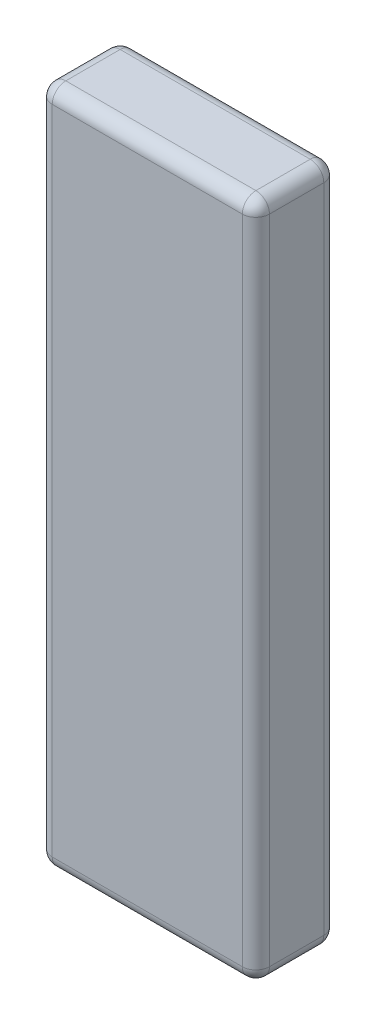
ISO-10303-21;
HEADER;
FILE_DESCRIPTION(('STEP AP214'),'2;1');
FILE_NAME('part.step','',(''),(''),'','','');
FILE_SCHEMA(('AUTOMOTIVE_DESIGN { 1 0 10303 214 1 1 1 1 }'));
ENDSEC;
DATA;
#1=APPLICATION_CONTEXT('core data for automotive mechanical design processes');
#2=APPLICATION_PROTOCOL_DEFINITION('international standard','automotive_design',2000,#1);
#3=PRODUCT_CONTEXT('',#1,'mechanical');
#4=PRODUCT('Part','Part','',(#3));
#5=PRODUCT_RELATED_PRODUCT_CATEGORY('part','',(#4));
#6=PRODUCT_DEFINITION_FORMATION('','',#4);
#7=PRODUCT_DEFINITION_CONTEXT('part definition',#1,'design');
#8=PRODUCT_DEFINITION('design','',#6,#7);
#9=PRODUCT_DEFINITION_SHAPE('','',#8);
#10=(LENGTH_UNIT() NAMED_UNIT(*) SI_UNIT(.MILLI.,.METRE.));
#11=(NAMED_UNIT(*) PLANE_ANGLE_UNIT() SI_UNIT($,.RADIAN.));
#12=(NAMED_UNIT(*) SI_UNIT($,.STERADIAN.) SOLID_ANGLE_UNIT());
#13=UNCERTAINTY_MEASURE_WITH_UNIT(LENGTH_MEASURE(1.E-05),#10,'distance_accuracy_value','');
#14=(GEOMETRIC_REPRESENTATION_CONTEXT(3) GLOBAL_UNCERTAINTY_ASSIGNED_CONTEXT((#13)) GLOBAL_UNIT_ASSIGNED_CONTEXT((#10,
#11,#12)) REPRESENTATION_CONTEXT('',''));
#15=CARTESIAN_POINT('',(0.,0.,0.));
#16=DIRECTION('',(0.,0.,1.));
#17=DIRECTION('',(1.,0.,0.));
#18=AXIS2_PLACEMENT_3D('',#15,#16,#17);
#19=CARTESIAN_POINT('',(-10.16,-31.75,7.62));
#20=DIRECTION('',(1.,0.,0.));
#21=DIRECTION('',(0.,0.,-1.));
#22=AXIS2_PLACEMENT_3D('',#19,#20,#21);
#23=PLANE('',#22);
#24=DIRECTION('',(0.,-1.,0.));
#25=VECTOR('',#24,1.);
#26=CARTESIAN_POINT('',(-10.16,-31.75,1.27));
#27=LINE('',#26,#25);
#28=CARTESIAN_POINT('',(-10.16,30.48,1.27));
#29=VERTEX_POINT('',#28);
#30=CARTESIAN_POINT('',(-10.16,-30.48,1.27));
#31=VERTEX_POINT('',#30);
#32=EDGE_CURVE('E179',#29,#31,#27,.T.);
#33=ORIENTED_EDGE('',*,*,#32,.T.);
#34=DIRECTION('',(0.,0.,-1.));
#35=VECTOR('',#34,1.);
#36=CARTESIAN_POINT('',(-10.16,-30.48,7.62));
#37=LINE('',#36,#35);
#38=CARTESIAN_POINT('',(-10.16,-30.48,6.35));
#39=VERTEX_POINT('',#38);
#40=EDGE_CURVE('E181',#31,#39,#37,.F.);
#41=ORIENTED_EDGE('',*,*,#40,.T.);
#42=DIRECTION('',(0.,-1.,0.));
#43=VECTOR('',#42,1.);
#44=CARTESIAN_POINT('',(-10.16,31.75,6.35));
#45=LINE('',#44,#43);
#46=CARTESIAN_POINT('',(-10.16,30.48,6.35));
#47=VERTEX_POINT('',#46);
#48=EDGE_CURVE('E177',#39,#47,#45,.F.);
#49=ORIENTED_EDGE('',*,*,#48,.T.);
#50=DIRECTION('',(0.,0.,-1.));
#51=VECTOR('',#50,1.);
#52=CARTESIAN_POINT('',(-10.16,30.48,7.62));
#53=LINE('',#52,#51);
#54=EDGE_CURVE('E175',#47,#29,#53,.T.);
#55=ORIENTED_EDGE('',*,*,#54,.T.);
#56=EDGE_LOOP('',(#33,#41,#49,#55));
#57=FACE_BOUND('',#56,.T.);
#58=ADVANCED_FACE('F37',(#57),#23,.F.);
#59=CARTESIAN_POINT('',(10.16,-31.75,7.62));
#60=DIRECTION('',(0.,1.,0.));
#61=DIRECTION('',(0.,0.,1.));
#62=AXIS2_PLACEMENT_3D('',#59,#60,#61);
#63=PLANE('',#62);
#64=DIRECTION('',(0.,0.,-1.));
#65=VECTOR('',#64,1.);
#66=CARTESIAN_POINT('',(-8.89,-31.75,7.62));
#67=LINE('',#66,#65);
#68=CARTESIAN_POINT('',(-8.89,-31.75,6.35));
#69=VERTEX_POINT('',#68);
#70=CARTESIAN_POINT('',(-8.89,-31.75,1.27));
#71=VERTEX_POINT('',#70);
#72=EDGE_CURVE('E162',#69,#71,#67,.T.);
#73=ORIENTED_EDGE('',*,*,#72,.T.);
#74=DIRECTION('',(1.,0.,0.));
#75=VECTOR('',#74,1.);
#76=CARTESIAN_POINT('',(10.16,-31.75,1.27));
#77=LINE('',#76,#75);
#78=CARTESIAN_POINT('',(8.89,-31.75,1.27));
#79=VERTEX_POINT('',#78);
#80=EDGE_CURVE('E134',#71,#79,#77,.T.);
#81=ORIENTED_EDGE('',*,*,#80,.T.);
#82=DIRECTION('',(0.,0.,-1.));
#83=VECTOR('',#82,1.);
#84=CARTESIAN_POINT('',(8.89,-31.75,7.62));
#85=LINE('',#84,#83);
#86=CARTESIAN_POINT('',(8.89,-31.75,6.35));
#87=VERTEX_POINT('',#86);
#88=EDGE_CURVE('E152',#79,#87,#85,.F.);
#89=ORIENTED_EDGE('',*,*,#88,.T.);
#90=DIRECTION('',(1.,0.,0.));
#91=VECTOR('',#90,1.);
#92=CARTESIAN_POINT('',(-10.16,-31.75,6.35));
#93=LINE('',#92,#91);
#94=EDGE_CURVE('E158',#87,#69,#93,.F.);
#95=ORIENTED_EDGE('',*,*,#94,.T.);
#96=EDGE_LOOP('',(#73,#81,#89,#95));
#97=FACE_BOUND('',#96,.T.);
#98=ADVANCED_FACE('F160',(#97),#63,.F.);
#99=CARTESIAN_POINT('',(10.16,-31.75,7.62));
#100=DIRECTION('',(-1.,0.,0.));
#101=DIRECTION('',(0.,0.,1.));
#102=AXIS2_PLACEMENT_3D('',#99,#100,#101);
#103=PLANE('',#102);
#104=DIRECTION('',(0.,1.,0.));
#105=VECTOR('',#104,1.);
#106=CARTESIAN_POINT('',(10.16,-31.75,6.35));
#107=LINE('',#106,#105);
#108=CARTESIAN_POINT('',(10.16,30.48,6.35));
#109=VERTEX_POINT('',#108);
#110=CARTESIAN_POINT('',(10.16,-30.48,6.35));
#111=VERTEX_POINT('',#110);
#112=EDGE_CURVE('E195',#109,#111,#107,.F.);
#113=ORIENTED_EDGE('',*,*,#112,.T.);
#114=DIRECTION('',(0.,0.,-1.));
#115=VECTOR('',#114,1.);
#116=CARTESIAN_POINT('',(10.16,-30.48,7.62));
#117=LINE('',#116,#115);
#118=CARTESIAN_POINT('',(10.16,-30.48,1.27));
#119=VERTEX_POINT('',#118);
#120=EDGE_CURVE('E199',#111,#119,#117,.T.);
#121=ORIENTED_EDGE('',*,*,#120,.T.);
#122=DIRECTION('',(0.,1.,0.));
#123=VECTOR('',#122,1.);
#124=CARTESIAN_POINT('',(10.16,-31.75,1.27));
#125=LINE('',#124,#123);
#126=CARTESIAN_POINT('',(10.16,30.48,1.27));
#127=VERTEX_POINT('',#126);
#128=EDGE_CURVE('E197',#119,#127,#125,.T.);
#129=ORIENTED_EDGE('',*,*,#128,.T.);
#130=DIRECTION('',(0.,0.,-1.));
#131=VECTOR('',#130,1.);
#132=CARTESIAN_POINT('',(10.16,30.48,7.62));
#133=LINE('',#132,#131);
#134=EDGE_CURVE('E193',#127,#109,#133,.F.);
#135=ORIENTED_EDGE('',*,*,#134,.T.);
#136=EDGE_LOOP('',(#113,#121,#129,#135));
#137=FACE_BOUND('',#136,.T.);
#138=ADVANCED_FACE('F333',(#137),#103,.F.);
#139=CARTESIAN_POINT('',(10.16,31.75,7.62));
#140=DIRECTION('',(0.,-1.,0.));
#141=DIRECTION('',(0.,0.,-1.));
#142=AXIS2_PLACEMENT_3D('',#139,#140,#141);
#143=PLANE('',#142);
#144=DIRECTION('',(0.,0.,-1.));
#145=VECTOR('',#144,1.);
#146=CARTESIAN_POINT('',(8.89,31.75,7.62));
#147=LINE('',#146,#145);
#148=CARTESIAN_POINT('',(8.89,31.75,6.35));
#149=VERTEX_POINT('',#148);
#150=CARTESIAN_POINT('',(8.89,31.75,1.27));
#151=VERTEX_POINT('',#150);
#152=EDGE_CURVE('E202',#149,#151,#147,.T.);
#153=ORIENTED_EDGE('',*,*,#152,.T.);
#154=DIRECTION('',(-1.,0.,0.));
#155=VECTOR('',#154,1.);
#156=CARTESIAN_POINT('',(10.16,31.75,1.27));
#157=LINE('',#156,#155);
#158=CARTESIAN_POINT('',(-8.89,31.75,1.27));
#159=VERTEX_POINT('',#158);
#160=EDGE_CURVE('E11',#151,#159,#157,.T.);
#161=ORIENTED_EDGE('',*,*,#160,.T.);
#162=DIRECTION('',(0.,0.,-1.));
#163=VECTOR('',#162,1.);
#164=CARTESIAN_POINT('',(-8.89,31.75,7.62));
#165=LINE('',#164,#163);
#166=CARTESIAN_POINT('',(-8.89,31.75,6.35));
#167=VERTEX_POINT('',#166);
#168=EDGE_CURVE('E46',#159,#167,#165,.F.);
#169=ORIENTED_EDGE('',*,*,#168,.T.);
#170=DIRECTION('',(-1.,0.,0.));
#171=VECTOR('',#170,1.);
#172=CARTESIAN_POINT('',(10.16,31.75,6.35));
#173=LINE('',#172,#171);
#174=EDGE_CURVE('E204',#167,#149,#173,.F.);
#175=ORIENTED_EDGE('',*,*,#174,.T.);
#176=EDGE_LOOP('',(#153,#161,#169,#175));
#177=FACE_BOUND('',#176,.T.);
#178=ADVANCED_FACE('F300',(#177),#143,.F.);
#179=CARTESIAN_POINT('',(0.,0.,7.62));
#180=DIRECTION('',(0.,0.,1.));
#181=DIRECTION('',(1.,0.,0.));
#182=AXIS2_PLACEMENT_3D('',#179,#180,#181);
#183=PLANE('',#182);
#184=DIRECTION('',(0.,-1.,0.));
#185=VECTOR('',#184,1.);
#186=CARTESIAN_POINT('',(-8.89,-31.75,7.62));
#187=LINE('',#186,#185);
#188=CARTESIAN_POINT('',(-8.89,30.48,7.62));
#189=VERTEX_POINT('',#188);
#190=CARTESIAN_POINT('',(-8.89,-30.48,7.62));
#191=VERTEX_POINT('',#190);
#192=EDGE_CURVE('E188',#189,#191,#187,.T.);
#193=ORIENTED_EDGE('',*,*,#192,.T.);
#194=DIRECTION('',(1.,0.,0.));
#195=VECTOR('',#194,1.);
#196=CARTESIAN_POINT('',(10.16,-30.48,7.62));
#197=LINE('',#196,#195);
#198=CARTESIAN_POINT('',(8.89,-30.48,7.62));
#199=VERTEX_POINT('',#198);
#200=EDGE_CURVE('E190',#191,#199,#197,.T.);
#201=ORIENTED_EDGE('',*,*,#200,.T.);
#202=DIRECTION('',(0.,1.,0.));
#203=VECTOR('',#202,1.);
#204=CARTESIAN_POINT('',(8.89,31.75,7.62));
#205=LINE('',#204,#203);
#206=CARTESIAN_POINT('',(8.89,30.48,7.62));
#207=VERTEX_POINT('',#206);
#208=EDGE_CURVE('E186',#199,#207,#205,.T.);
#209=ORIENTED_EDGE('',*,*,#208,.T.);
#210=DIRECTION('',(-1.,0.,0.));
#211=VECTOR('',#210,1.);
#212=CARTESIAN_POINT('',(-10.16,30.48,7.62));
#213=LINE('',#212,#211);
#214=EDGE_CURVE('E184',#207,#189,#213,.T.);
#215=ORIENTED_EDGE('',*,*,#214,.T.);
#216=EDGE_LOOP('',(#193,#201,#209,#215));
#217=FACE_BOUND('',#216,.T.);
#218=ADVANCED_FACE('F281',(#217),#183,.T.);
#219=CARTESIAN_POINT('',(0.,0.,0.));
#220=DIRECTION('',(0.,0.,1.));
#221=DIRECTION('',(1.,0.,0.));
#222=AXIS2_PLACEMENT_3D('',#219,#220,#221);
#223=PLANE('',#222);
#224=DIRECTION('',(0.,1.,0.));
#225=VECTOR('',#224,1.);
#226=CARTESIAN_POINT('',(8.89,0.,0.));
#227=LINE('',#226,#225);
#228=CARTESIAN_POINT('',(8.89,30.48,0.));
#229=VERTEX_POINT('',#228);
#230=CARTESIAN_POINT('',(8.89,-30.48,0.));
#231=VERTEX_POINT('',#230);
#232=EDGE_CURVE('E166',#229,#231,#227,.F.);
#233=ORIENTED_EDGE('',*,*,#232,.T.);
#234=DIRECTION('',(1.,0.,0.));
#235=VECTOR('',#234,1.);
#236=CARTESIAN_POINT('',(0.,-30.48,0.));
#237=LINE('',#236,#235);
#238=CARTESIAN_POINT('',(-8.89,-30.48,0.));
#239=VERTEX_POINT('',#238);
#240=EDGE_CURVE('E136',#231,#239,#237,.F.);
#241=ORIENTED_EDGE('',*,*,#240,.T.);
#242=DIRECTION('',(0.,-1.,0.));
#243=VECTOR('',#242,1.);
#244=CARTESIAN_POINT('',(-8.89,0.,0.));
#245=LINE('',#244,#243);
#246=CARTESIAN_POINT('',(-8.89,30.48,0.));
#247=VERTEX_POINT('',#246);
#248=EDGE_CURVE('E172',#239,#247,#245,.F.);
#249=ORIENTED_EDGE('',*,*,#248,.T.);
#250=DIRECTION('',(-1.,0.,0.));
#251=VECTOR('',#250,1.);
#252=CARTESIAN_POINT('',(0.,30.48,0.));
#253=LINE('',#252,#251);
#254=EDGE_CURVE('E164',#247,#229,#253,.F.);
#255=ORIENTED_EDGE('',*,*,#254,.T.);
#256=EDGE_LOOP('',(#233,#241,#249,#255));
#257=FACE_BOUND('',#256,.T.);
#258=ADVANCED_FACE('F359',(#257),#223,.F.);
#259=CARTESIAN_POINT('',(0.,30.48,6.35));
#260=DIRECTION('',(1.,0.,0.));
#261=DIRECTION('',(0.,0.,-1.));
#262=AXIS2_PLACEMENT_3D('',#259,#260,#261);
#263=CYLINDRICAL_SURFACE('',#262,1.27);
#264=CARTESIAN_POINT('',(-8.89,30.48,6.35));
#265=DIRECTION('',(-1.,0.,0.));
#266=DIRECTION('',(0.,0.,1.));
#267=AXIS2_PLACEMENT_3D('',#264,#265,#266);
#268=CIRCLE('',#267,1.27);
#269=EDGE_CURVE('E41',#189,#167,#268,.T.);
#270=ORIENTED_EDGE('',*,*,#269,.F.);
#271=ORIENTED_EDGE('',*,*,#214,.F.);
#272=CARTESIAN_POINT('',(8.89,30.48,6.35));
#273=DIRECTION('',(1.,0.,0.));
#274=DIRECTION('',(0.,0.,-1.));
#275=AXIS2_PLACEMENT_3D('',#272,#273,#274);
#276=CIRCLE('',#275,1.27);
#277=EDGE_CURVE('E254',#149,#207,#276,.T.);
#278=ORIENTED_EDGE('',*,*,#277,.F.);
#279=ORIENTED_EDGE('',*,*,#174,.F.);
#280=EDGE_LOOP('',(#270,#271,#278,#279));
#281=FACE_BOUND('',#280,.T.);
#282=ADVANCED_FACE('F39',(#281),#263,.T.);
#283=CARTESIAN_POINT('',(-8.89,30.48,6.35));
#284=DIRECTION('',(0.,0.,1.));
#285=DIRECTION('',(1.,0.,0.));
#286=AXIS2_PLACEMENT_3D('',#283,#284,#285);
#287=SPHERICAL_SURFACE('',#286,1.27);
#288=CARTESIAN_POINT('',(-8.89,30.48,6.35));
#289=DIRECTION('',(0.,1.,0.));
#290=DIRECTION('',(0.,0.,1.));
#291=AXIS2_PLACEMENT_3D('',#288,#289,#290);
#292=CIRCLE('',#291,1.27);
#293=EDGE_CURVE('E249',#189,#47,#292,.F.);
#294=ORIENTED_EDGE('',*,*,#293,.F.);
#295=ORIENTED_EDGE('',*,*,#269,.T.);
#296=CARTESIAN_POINT('',(-8.89,30.48,6.35));
#297=DIRECTION('',(0.,0.,1.));
#298=DIRECTION('',(1.,0.,0.));
#299=AXIS2_PLACEMENT_3D('',#296,#297,#298);
#300=CIRCLE('',#299,1.27);
#301=EDGE_CURVE('E252',#47,#167,#300,.F.);
#302=ORIENTED_EDGE('',*,*,#301,.F.);
#303=EDGE_LOOP('',(#294,#295,#302));
#304=FACE_BOUND('',#303,.T.);
#305=ADVANCED_FACE('F265',(#304),#287,.T.);
#306=CARTESIAN_POINT('',(8.89,30.48,6.35));
#307=DIRECTION('',(0.,0.,1.));
#308=DIRECTION('',(1.,0.,0.));
#309=AXIS2_PLACEMENT_3D('',#306,#307,#308);
#310=SPHERICAL_SURFACE('',#309,1.27);
#311=CARTESIAN_POINT('',(8.89,30.48,6.35));
#312=DIRECTION('',(0.,0.,1.));
#313=DIRECTION('',(1.,0.,0.));
#314=AXIS2_PLACEMENT_3D('',#311,#312,#313);
#315=CIRCLE('',#314,1.27);
#316=EDGE_CURVE('E243',#149,#109,#315,.F.);
#317=ORIENTED_EDGE('',*,*,#316,.F.);
#318=ORIENTED_EDGE('',*,*,#277,.T.);
#319=CARTESIAN_POINT('',(8.89,30.48,6.35));
#320=DIRECTION('',(0.,1.,0.));
#321=DIRECTION('',(0.,0.,1.));
#322=AXIS2_PLACEMENT_3D('',#319,#320,#321);
#323=CIRCLE('',#322,1.27);
#324=EDGE_CURVE('E246',#109,#207,#323,.F.);
#325=ORIENTED_EDGE('',*,*,#324,.F.);
#326=EDGE_LOOP('',(#317,#318,#325));
#327=FACE_BOUND('',#326,.T.);
#328=ADVANCED_FACE('F294',(#327),#310,.T.);
#329=CARTESIAN_POINT('',(-8.89,30.48,7.62));
#330=DIRECTION('',(0.,0.,-1.));
#331=DIRECTION('',(-1.,0.,0.));
#332=AXIS2_PLACEMENT_3D('',#329,#330,#331);
#333=CYLINDRICAL_SURFACE('',#332,1.27);
#334=ORIENTED_EDGE('',*,*,#301,.T.);
#335=ORIENTED_EDGE('',*,*,#168,.F.);
#336=CARTESIAN_POINT('',(-8.89,30.48,1.27));
#337=DIRECTION('',(0.,0.,-1.));
#338=DIRECTION('',(-1.,0.,0.));
#339=AXIS2_PLACEMENT_3D('',#336,#337,#338);
#340=CIRCLE('',#339,1.27);
#341=EDGE_CURVE('E54',#29,#159,#340,.T.);
#342=ORIENTED_EDGE('',*,*,#341,.F.);
#343=ORIENTED_EDGE('',*,*,#54,.F.);
#344=EDGE_LOOP('',(#334,#335,#342,#343));
#345=FACE_BOUND('',#344,.T.);
#346=ADVANCED_FACE('F271',(#345),#333,.T.);
#347=CARTESIAN_POINT('',(-8.89,0.,6.35));
#348=DIRECTION('',(0.,1.,0.));
#349=DIRECTION('',(0.,0.,1.));
#350=AXIS2_PLACEMENT_3D('',#347,#348,#349);
#351=CYLINDRICAL_SURFACE('',#350,1.27);
#352=ORIENTED_EDGE('',*,*,#293,.T.);
#353=ORIENTED_EDGE('',*,*,#48,.F.);
#354=CARTESIAN_POINT('',(-8.89,-30.48,6.35));
#355=DIRECTION('',(0.,-1.,0.));
#356=DIRECTION('',(0.,0.,-1.));
#357=AXIS2_PLACEMENT_3D('',#354,#355,#356);
#358=CIRCLE('',#357,1.27);
#359=EDGE_CURVE('E237',#191,#39,#358,.T.);
#360=ORIENTED_EDGE('',*,*,#359,.F.);
#361=ORIENTED_EDGE('',*,*,#192,.F.);
#362=EDGE_LOOP('',(#352,#353,#360,#361));
#363=FACE_BOUND('',#362,.T.);
#364=ADVANCED_FACE('F278',(#363),#351,.T.);
#365=CARTESIAN_POINT('',(0.,-30.48,6.35));
#366=DIRECTION('',(-1.,0.,0.));
#367=DIRECTION('',(0.,0.,1.));
#368=AXIS2_PLACEMENT_3D('',#365,#366,#367);
#369=CYLINDRICAL_SURFACE('',#368,1.27);
#370=CARTESIAN_POINT('',(8.89,-30.48,6.35));
#371=DIRECTION('',(1.,0.,0.));
#372=DIRECTION('',(0.,0.,-1.));
#373=AXIS2_PLACEMENT_3D('',#370,#371,#372);
#374=CIRCLE('',#373,1.27);
#375=EDGE_CURVE('E231',#199,#87,#374,.T.);
#376=ORIENTED_EDGE('',*,*,#375,.F.);
#377=ORIENTED_EDGE('',*,*,#200,.F.);
#378=CARTESIAN_POINT('',(-8.89,-30.48,6.35));
#379=DIRECTION('',(-1.,0.,0.));
#380=DIRECTION('',(0.,0.,1.));
#381=AXIS2_PLACEMENT_3D('',#378,#379,#380);
#382=CIRCLE('',#381,1.27);
#383=EDGE_CURVE('E234',#69,#191,#382,.T.);
#384=ORIENTED_EDGE('',*,*,#383,.F.);
#385=ORIENTED_EDGE('',*,*,#94,.F.);
#386=EDGE_LOOP('',(#376,#377,#384,#385));
#387=FACE_BOUND('',#386,.T.);
#388=ADVANCED_FACE('F285',(#387),#369,.T.);
#389=CARTESIAN_POINT('',(8.89,0.,6.35));
#390=DIRECTION('',(0.,-1.,0.));
#391=DIRECTION('',(0.,0.,-1.));
#392=AXIS2_PLACEMENT_3D('',#389,#390,#391);
#393=CYLINDRICAL_SURFACE('',#392,1.27);
#394=ORIENTED_EDGE('',*,*,#324,.T.);
#395=ORIENTED_EDGE('',*,*,#208,.F.);
#396=CARTESIAN_POINT('',(8.89,-30.48,6.35));
#397=DIRECTION('',(0.,-1.,0.));
#398=DIRECTION('',(0.,0.,-1.));
#399=AXIS2_PLACEMENT_3D('',#396,#397,#398);
#400=CIRCLE('',#399,1.27);
#401=EDGE_CURVE('E229',#111,#199,#400,.T.);
#402=ORIENTED_EDGE('',*,*,#401,.F.);
#403=ORIENTED_EDGE('',*,*,#112,.F.);
#404=EDGE_LOOP('',(#394,#395,#402,#403));
#405=FACE_BOUND('',#404,.T.);
#406=ADVANCED_FACE('F291',(#405),#393,.T.);
#407=CARTESIAN_POINT('',(8.89,30.48,7.62));
#408=DIRECTION('',(0.,0.,-1.));
#409=DIRECTION('',(-1.,0.,0.));
#410=AXIS2_PLACEMENT_3D('',#407,#408,#409);
#411=CYLINDRICAL_SURFACE('',#410,1.27);
#412=ORIENTED_EDGE('',*,*,#316,.T.);
#413=ORIENTED_EDGE('',*,*,#134,.F.);
#414=CARTESIAN_POINT('',(8.89,30.48,1.27));
#415=DIRECTION('',(0.,0.,-1.));
#416=DIRECTION('',(-1.,0.,0.));
#417=AXIS2_PLACEMENT_3D('',#414,#415,#416);
#418=CIRCLE('',#417,1.27);
#419=EDGE_CURVE('E226',#151,#127,#418,.T.);
#420=ORIENTED_EDGE('',*,*,#419,.F.);
#421=ORIENTED_EDGE('',*,*,#152,.F.);
#422=EDGE_LOOP('',(#412,#413,#420,#421));
#423=FACE_BOUND('',#422,.T.);
#424=ADVANCED_FACE('F298',(#423),#411,.T.);
#425=CARTESIAN_POINT('',(10.16,30.48,1.27));
#426=DIRECTION('',(-1.,0.,0.));
#427=DIRECTION('',(0.,0.,1.));
#428=AXIS2_PLACEMENT_3D('',#425,#426,#427);
#429=CYLINDRICAL_SURFACE('',#428,1.27);
#430=CARTESIAN_POINT('',(-8.89,30.48,1.27));
#431=DIRECTION('',(-1.,0.,0.));
#432=DIRECTION('',(0.,0.,1.));
#433=AXIS2_PLACEMENT_3D('',#430,#431,#432);
#434=CIRCLE('',#433,1.27);
#435=EDGE_CURVE('E241',#159,#247,#434,.T.);
#436=ORIENTED_EDGE('',*,*,#435,.F.);
#437=ORIENTED_EDGE('',*,*,#160,.F.);
#438=CARTESIAN_POINT('',(8.89,30.48,1.27));
#439=DIRECTION('',(1.,0.,0.));
#440=DIRECTION('',(0.,0.,-1.));
#441=AXIS2_PLACEMENT_3D('',#438,#439,#440);
#442=CIRCLE('',#441,1.27);
#443=EDGE_CURVE('E223',#229,#151,#442,.T.);
#444=ORIENTED_EDGE('',*,*,#443,.F.);
#445=ORIENTED_EDGE('',*,*,#254,.F.);
#446=EDGE_LOOP('',(#436,#437,#444,#445));
#447=FACE_BOUND('',#446,.T.);
#448=ADVANCED_FACE('F303',(#447),#429,.T.);
#449=CARTESIAN_POINT('',(-8.89,30.48,1.27));
#450=DIRECTION('',(0.,0.,1.));
#451=DIRECTION('',(1.,0.,0.));
#452=AXIS2_PLACEMENT_3D('',#449,#450,#451);
#453=SPHERICAL_SURFACE('',#452,1.27);
#454=ORIENTED_EDGE('',*,*,#341,.T.);
#455=ORIENTED_EDGE('',*,*,#435,.T.);
#456=CARTESIAN_POINT('',(-8.89,30.48,1.27));
#457=DIRECTION('',(0.,1.,0.));
#458=DIRECTION('',(0.,0.,1.));
#459=AXIS2_PLACEMENT_3D('',#456,#457,#458);
#460=CIRCLE('',#459,1.27);
#461=EDGE_CURVE('E220',#29,#247,#460,.F.);
#462=ORIENTED_EDGE('',*,*,#461,.F.);
#463=EDGE_LOOP('',(#454,#455,#462));
#464=FACE_BOUND('',#463,.T.);
#465=ADVANCED_FACE('F306',(#464),#453,.T.);
#466=CARTESIAN_POINT('',(-8.89,-30.48,6.35));
#467=DIRECTION('',(0.,0.,1.));
#468=DIRECTION('',(1.,0.,0.));
#469=AXIS2_PLACEMENT_3D('',#466,#467,#468);
#470=SPHERICAL_SURFACE('',#469,1.27);
#471=ORIENTED_EDGE('',*,*,#383,.T.);
#472=ORIENTED_EDGE('',*,*,#359,.T.);
#473=CARTESIAN_POINT('',(-8.89,-30.48,6.35));
#474=DIRECTION('',(0.,0.,1.));
#475=DIRECTION('',(1.,0.,0.));
#476=AXIS2_PLACEMENT_3D('',#473,#474,#475);
#477=CIRCLE('',#476,1.27);
#478=EDGE_CURVE('E218',#69,#39,#477,.F.);
#479=ORIENTED_EDGE('',*,*,#478,.F.);
#480=EDGE_LOOP('',(#471,#472,#479));
#481=FACE_BOUND('',#480,.T.);
#482=ADVANCED_FACE('F317',(#481),#470,.T.);
#483=CARTESIAN_POINT('',(8.89,-30.48,6.35));
#484=DIRECTION('',(0.,0.,1.));
#485=DIRECTION('',(1.,0.,0.));
#486=AXIS2_PLACEMENT_3D('',#483,#484,#485);
#487=SPHERICAL_SURFACE('',#486,1.27);
#488=ORIENTED_EDGE('',*,*,#401,.T.);
#489=ORIENTED_EDGE('',*,*,#375,.T.);
#490=CARTESIAN_POINT('',(8.89,-30.48,6.35));
#491=DIRECTION('',(0.,0.,1.));
#492=DIRECTION('',(1.,0.,0.));
#493=AXIS2_PLACEMENT_3D('',#490,#491,#492);
#494=CIRCLE('',#493,1.27);
#495=EDGE_CURVE('E155',#111,#87,#494,.F.);
#496=ORIENTED_EDGE('',*,*,#495,.F.);
#497=EDGE_LOOP('',(#488,#489,#496));
#498=FACE_BOUND('',#497,.T.);
#499=ADVANCED_FACE('F319',(#498),#487,.T.);
#500=CARTESIAN_POINT('',(8.89,30.48,1.27));
#501=DIRECTION('',(0.,0.,1.));
#502=DIRECTION('',(1.,0.,0.));
#503=AXIS2_PLACEMENT_3D('',#500,#501,#502);
#504=SPHERICAL_SURFACE('',#503,1.27);
#505=ORIENTED_EDGE('',*,*,#443,.T.);
#506=ORIENTED_EDGE('',*,*,#419,.T.);
#507=CARTESIAN_POINT('',(8.89,30.48,1.27));
#508=DIRECTION('',(0.,1.,0.));
#509=DIRECTION('',(0.,0.,1.));
#510=AXIS2_PLACEMENT_3D('',#507,#508,#509);
#511=CIRCLE('',#510,1.27);
#512=EDGE_CURVE('E214',#229,#127,#511,.F.);
#513=ORIENTED_EDGE('',*,*,#512,.F.);
#514=EDGE_LOOP('',(#505,#506,#513));
#515=FACE_BOUND('',#514,.T.);
#516=ADVANCED_FACE('F325',(#515),#504,.T.);
#517=CARTESIAN_POINT('',(-8.89,-31.75,1.27));
#518=DIRECTION('',(0.,-1.,0.));
#519=DIRECTION('',(0.,0.,-1.));
#520=AXIS2_PLACEMENT_3D('',#517,#518,#519);
#521=CYLINDRICAL_SURFACE('',#520,1.27);
#522=ORIENTED_EDGE('',*,*,#461,.T.);
#523=ORIENTED_EDGE('',*,*,#248,.F.);
#524=CARTESIAN_POINT('',(-8.89,-30.48,1.27));
#525=DIRECTION('',(0.,-1.,0.));
#526=DIRECTION('',(0.,0.,-1.));
#527=AXIS2_PLACEMENT_3D('',#524,#525,#526);
#528=CIRCLE('',#527,1.27);
#529=EDGE_CURVE('E211',#31,#239,#528,.T.);
#530=ORIENTED_EDGE('',*,*,#529,.F.);
#531=ORIENTED_EDGE('',*,*,#32,.F.);
#532=EDGE_LOOP('',(#522,#523,#530,#531));
#533=FACE_BOUND('',#532,.T.);
#534=ADVANCED_FACE('F309',(#533),#521,.T.);
#535=CARTESIAN_POINT('',(-8.89,-30.48,7.62));
#536=DIRECTION('',(0.,0.,-1.));
#537=DIRECTION('',(-1.,0.,0.));
#538=AXIS2_PLACEMENT_3D('',#535,#536,#537);
#539=CYLINDRICAL_SURFACE('',#538,1.27);
#540=ORIENTED_EDGE('',*,*,#478,.T.);
#541=ORIENTED_EDGE('',*,*,#40,.F.);
#542=CARTESIAN_POINT('',(-8.89,-30.48,1.27));
#543=DIRECTION('',(0.,0.,-1.));
#544=DIRECTION('',(-1.,0.,0.));
#545=AXIS2_PLACEMENT_3D('',#542,#543,#544);
#546=CIRCLE('',#545,1.27);
#547=EDGE_CURVE('E149',#71,#31,#546,.T.);
#548=ORIENTED_EDGE('',*,*,#547,.F.);
#549=ORIENTED_EDGE('',*,*,#72,.F.);
#550=EDGE_LOOP('',(#540,#541,#548,#549));
#551=FACE_BOUND('',#550,.T.);
#552=ADVANCED_FACE('F315',(#551),#539,.T.);
#553=CARTESIAN_POINT('',(8.89,-30.48,7.62));
#554=DIRECTION('',(0.,0.,-1.));
#555=DIRECTION('',(-1.,0.,0.));
#556=AXIS2_PLACEMENT_3D('',#553,#554,#555);
#557=CYLINDRICAL_SURFACE('',#556,1.27);
#558=ORIENTED_EDGE('',*,*,#495,.T.);
#559=ORIENTED_EDGE('',*,*,#88,.F.);
#560=CARTESIAN_POINT('',(8.89,-30.48,1.27));
#561=DIRECTION('',(0.,0.,-1.));
#562=DIRECTION('',(-1.,0.,0.));
#563=AXIS2_PLACEMENT_3D('',#560,#561,#562);
#564=CIRCLE('',#563,1.27);
#565=EDGE_CURVE('E141',#119,#79,#564,.T.);
#566=ORIENTED_EDGE('',*,*,#565,.F.);
#567=ORIENTED_EDGE('',*,*,#120,.F.);
#568=EDGE_LOOP('',(#558,#559,#566,#567));
#569=FACE_BOUND('',#568,.T.);
#570=ADVANCED_FACE('F153',(#569),#557,.T.);
#571=CARTESIAN_POINT('',(8.89,-31.75,1.27));
#572=DIRECTION('',(0.,1.,0.));
#573=DIRECTION('',(0.,0.,1.));
#574=AXIS2_PLACEMENT_3D('',#571,#572,#573);
#575=CYLINDRICAL_SURFACE('',#574,1.27);
#576=ORIENTED_EDGE('',*,*,#512,.T.);
#577=ORIENTED_EDGE('',*,*,#128,.F.);
#578=CARTESIAN_POINT('',(8.89,-30.48,1.27));
#579=DIRECTION('',(0.,-1.,0.));
#580=DIRECTION('',(0.,0.,-1.));
#581=AXIS2_PLACEMENT_3D('',#578,#579,#580);
#582=CIRCLE('',#581,1.27);
#583=EDGE_CURVE('E145',#231,#119,#582,.T.);
#584=ORIENTED_EDGE('',*,*,#583,.F.);
#585=ORIENTED_EDGE('',*,*,#232,.F.);
#586=EDGE_LOOP('',(#576,#577,#584,#585));
#587=FACE_BOUND('',#586,.T.);
#588=ADVANCED_FACE('F343',(#587),#575,.T.);
#589=CARTESIAN_POINT('',(-8.89,-30.48,1.27));
#590=DIRECTION('',(0.,0.,1.));
#591=DIRECTION('',(1.,0.,0.));
#592=AXIS2_PLACEMENT_3D('',#589,#590,#591);
#593=SPHERICAL_SURFACE('',#592,1.27);
#594=ORIENTED_EDGE('',*,*,#547,.T.);
#595=ORIENTED_EDGE('',*,*,#529,.T.);
#596=CARTESIAN_POINT('',(-8.89,-30.48,1.27));
#597=DIRECTION('',(-1.,0.,0.));
#598=DIRECTION('',(0.,-1.,0.));
#599=AXIS2_PLACEMENT_3D('',#596,#597,#598);
#600=CIRCLE('',#599,1.27);
#601=EDGE_CURVE('E138',#71,#239,#600,.F.);
#602=ORIENTED_EDGE('',*,*,#601,.F.);
#603=EDGE_LOOP('',(#594,#595,#602));
#604=FACE_BOUND('',#603,.T.);
#605=ADVANCED_FACE('F313',(#604),#593,.T.);
#606=CARTESIAN_POINT('',(8.89,-30.48,1.27));
#607=DIRECTION('',(0.,0.,1.));
#608=DIRECTION('',(1.,0.,0.));
#609=AXIS2_PLACEMENT_3D('',#606,#607,#608);
#610=SPHERICAL_SURFACE('',#609,1.27);
#611=ORIENTED_EDGE('',*,*,#583,.T.);
#612=ORIENTED_EDGE('',*,*,#565,.T.);
#613=CARTESIAN_POINT('',(8.89,-30.48,1.27));
#614=DIRECTION('',(1.,0.,0.));
#615=DIRECTION('',(0.,0.,-1.));
#616=AXIS2_PLACEMENT_3D('',#613,#614,#615);
#617=CIRCLE('',#616,1.27);
#618=EDGE_CURVE('E130',#231,#79,#617,.F.);
#619=ORIENTED_EDGE('',*,*,#618,.F.);
#620=EDGE_LOOP('',(#611,#612,#619));
#621=FACE_BOUND('',#620,.T.);
#622=ADVANCED_FACE('F143',(#621),#610,.T.);
#623=CARTESIAN_POINT('',(10.16,-30.48,1.27));
#624=DIRECTION('',(1.,0.,0.));
#625=DIRECTION('',(0.,0.,-1.));
#626=AXIS2_PLACEMENT_3D('',#623,#624,#625);
#627=CYLINDRICAL_SURFACE('',#626,1.27);
#628=ORIENTED_EDGE('',*,*,#601,.T.);
#629=ORIENTED_EDGE('',*,*,#240,.F.);
#630=ORIENTED_EDGE('',*,*,#618,.T.);
#631=ORIENTED_EDGE('',*,*,#80,.F.);
#632=EDGE_LOOP('',(#628,#629,#630,#631));
#633=FACE_BOUND('',#632,.T.);
#634=ADVANCED_FACE('F132',(#633),#627,.T.);
#635=CLOSED_SHELL('',(#58,#98,#138,#178,#218,#258,#282,#305,#328,#346,#364,#388,#406,#424,#448,
#465,#482,#499,#516,#534,#552,#570,#588,#605,#622,#634));
#636=MANIFOLD_SOLID_BREP('B2',#635);
#637=ADVANCED_BREP_SHAPE_REPRESENTATION('',(#18,#636),#14);
#638=SHAPE_DEFINITION_REPRESENTATION(#9,#637);
ENDSEC;
END-ISO-10303-21;
